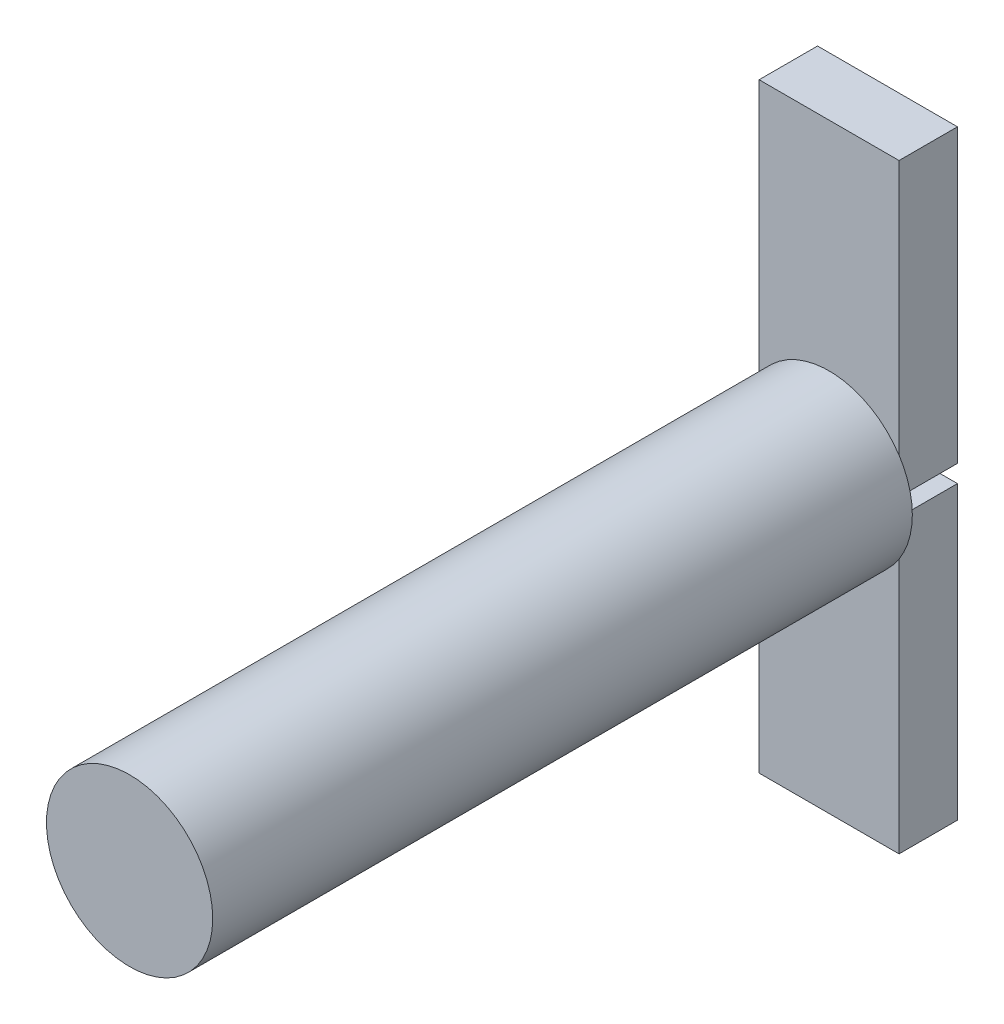
ISO-10303-21;
HEADER;
FILE_DESCRIPTION(('STEP AP214'),'2;1');
FILE_NAME('part.step','',(''),(''),'','','');
FILE_SCHEMA(('AUTOMOTIVE_DESIGN { 1 0 10303 214 1 1 1 1 }'));
ENDSEC;
DATA;
#1=APPLICATION_CONTEXT('core data for automotive mechanical design processes');
#2=APPLICATION_PROTOCOL_DEFINITION('international standard','automotive_design',2000,#1);
#3=PRODUCT_CONTEXT('',#1,'mechanical');
#4=PRODUCT('Part','Part','',(#3));
#5=PRODUCT_RELATED_PRODUCT_CATEGORY('part','',(#4));
#6=PRODUCT_DEFINITION_FORMATION('','',#4);
#7=PRODUCT_DEFINITION_CONTEXT('part definition',#1,'design');
#8=PRODUCT_DEFINITION('design','',#6,#7);
#9=PRODUCT_DEFINITION_SHAPE('','',#8);
#10=(LENGTH_UNIT() NAMED_UNIT(*) SI_UNIT(.MILLI.,.METRE.));
#11=(NAMED_UNIT(*) PLANE_ANGLE_UNIT() SI_UNIT($,.RADIAN.));
#12=(NAMED_UNIT(*) SI_UNIT($,.STERADIAN.) SOLID_ANGLE_UNIT());
#13=UNCERTAINTY_MEASURE_WITH_UNIT(LENGTH_MEASURE(1.E-05),#10,'distance_accuracy_value','');
#14=(GEOMETRIC_REPRESENTATION_CONTEXT(3) GLOBAL_UNCERTAINTY_ASSIGNED_CONTEXT((#13)) GLOBAL_UNIT_ASSIGNED_CONTEXT((#10,
#11,#12)) REPRESENTATION_CONTEXT('',''));
#15=CARTESIAN_POINT('',(0.,0.,0.));
#16=DIRECTION('',(0.,0.,1.));
#17=DIRECTION('',(1.,0.,0.));
#18=AXIS2_PLACEMENT_3D('',#15,#16,#17);
#19=CARTESIAN_POINT('',(0.,0.,60.));
#20=DIRECTION('',(0.,0.,-1.));
#21=DIRECTION('',(-1.,0.,0.));
#22=AXIS2_PLACEMENT_3D('',#19,#20,#21);
#23=CYLINDRICAL_SURFACE('',#22,7.13);
#24=CARTESIAN_POINT('',(0.,0.,60.));
#25=DIRECTION('',(0.,0.,1.));
#26=DIRECTION('',(1.,0.,0.));
#27=AXIS2_PLACEMENT_3D('',#24,#25,#26);
#28=CIRCLE('',#27,7.13);
#29=CARTESIAN_POINT('',(7.13,0.,60.));
#30=VERTEX_POINT('',#29);
#31=EDGE_CURVE('E234',#30,#30,#28,.T.);
#32=ORIENTED_EDGE('',*,*,#31,.F.);
#33=EDGE_LOOP('',(#32));
#34=FACE_BOUND('',#33,.T.);
#35=CARTESIAN_POINT('',(0.,0.,0.0100000000000031));
#36=DIRECTION('',(0.,0.,-1.));
#37=DIRECTION('',(-1.,0.,0.));
#38=AXIS2_PLACEMENT_3D('',#35,#36,#37);
#39=CIRCLE('',#38,7.13);
#40=CARTESIAN_POINT('',(-6.,3.85186967588469,0.0100000000000031));
#41=VERTEX_POINT('',#40);
#42=CARTESIAN_POINT('',(6.,3.85186967588469,0.0100000000000031));
#43=VERTEX_POINT('',#42);
#44=EDGE_CURVE('E11',#41,#43,#39,.T.);
#45=ORIENTED_EDGE('',*,*,#44,.F.);
#46=DIRECTION('',(0.,0.,-1.));
#47=VECTOR('',#46,1.);
#48=CARTESIAN_POINT('',(-6.,3.85186967588469,60.));
#49=LINE('',#48,#47);
#50=CARTESIAN_POINT('',(-6.,3.85186967588469,0.));
#51=VERTEX_POINT('',#50);
#52=EDGE_CURVE('E182',#41,#51,#49,.T.);
#53=ORIENTED_EDGE('',*,*,#52,.T.);
#54=CARTESIAN_POINT('',(0.,0.,0.));
#55=DIRECTION('',(0.,0.,1.));
#56=DIRECTION('',(1.,0.,0.));
#57=AXIS2_PLACEMENT_3D('',#54,#55,#56);
#58=CIRCLE('',#57,7.13);
#59=CARTESIAN_POINT('',(-6.,-3.85186967588469,0.));
#60=VERTEX_POINT('',#59);
#61=EDGE_CURVE('E62',#51,#60,#58,.T.);
#62=ORIENTED_EDGE('',*,*,#61,.T.);
#63=DIRECTION('',(0.,0.,-1.));
#64=VECTOR('',#63,1.);
#65=CARTESIAN_POINT('',(-6.,-3.85186967588469,60.));
#66=LINE('',#65,#64);
#67=CARTESIAN_POINT('',(-6.,-3.85186967588469,0.0100000000000031));
#68=VERTEX_POINT('',#67);
#69=EDGE_CURVE('E217',#60,#68,#66,.F.);
#70=ORIENTED_EDGE('',*,*,#69,.T.);
#71=CARTESIAN_POINT('',(0.,0.,0.0100000000000031));
#72=DIRECTION('',(0.,0.,1.));
#73=DIRECTION('',(1.,0.,0.));
#74=AXIS2_PLACEMENT_3D('',#71,#72,#73);
#75=CIRCLE('',#74,7.13);
#76=CARTESIAN_POINT('',(6.,-3.85186967588469,0.0100000000000031));
#77=VERTEX_POINT('',#76);
#78=EDGE_CURVE('E254',#68,#77,#75,.T.);
#79=ORIENTED_EDGE('',*,*,#78,.T.);
#80=DIRECTION('',(0.,0.,-1.));
#81=VECTOR('',#80,1.);
#82=CARTESIAN_POINT('',(6.,-3.85186967588469,60.));
#83=LINE('',#82,#81);
#84=CARTESIAN_POINT('',(6.,-3.85186967588469,0.));
#85=VERTEX_POINT('',#84);
#86=EDGE_CURVE('E230',#77,#85,#83,.T.);
#87=ORIENTED_EDGE('',*,*,#86,.T.);
#88=CARTESIAN_POINT('',(6.,3.85186967588469,0.));
#89=VERTEX_POINT('',#88);
#90=EDGE_CURVE('E239',#85,#89,#58,.T.);
#91=ORIENTED_EDGE('',*,*,#90,.T.);
#92=DIRECTION('',(0.,0.,-1.));
#93=VECTOR('',#92,1.);
#94=CARTESIAN_POINT('',(6.,3.85186967588469,60.));
#95=LINE('',#94,#93);
#96=EDGE_CURVE('E54',#89,#43,#95,.F.);
#97=ORIENTED_EDGE('',*,*,#96,.T.);
#98=EDGE_LOOP('',(#45,#53,#62,#70,#79,#87,#91,#97));
#99=FACE_BOUND('',#98,.T.);
#100=ADVANCED_FACE('F39',(#34,#99),#23,.T.);
#101=CARTESIAN_POINT('',(0.,0.,60.));
#102=DIRECTION('',(0.,0.,1.));
#103=DIRECTION('',(1.,0.,0.));
#104=AXIS2_PLACEMENT_3D('',#101,#102,#103);
#105=PLANE('',#104);
#106=ORIENTED_EDGE('',*,*,#31,.T.);
#107=EDGE_LOOP('',(#106));
#108=FACE_BOUND('',#107,.T.);
#109=ADVANCED_FACE('F287',(#108),#105,.T.);
#110=CARTESIAN_POINT('',(0.,0.,0.));
#111=DIRECTION('',(0.,0.,1.));
#112=DIRECTION('',(1.,0.,0.));
#113=AXIS2_PLACEMENT_3D('',#110,#111,#112);
#114=PLANE('',#113);
#115=ORIENTED_EDGE('',*,*,#61,.F.);
#116=DIRECTION('',(0.,-1.,0.));
#117=VECTOR('',#116,1.);
#118=CARTESIAN_POINT('',(-6.,0.,0.));
#119=LINE('',#118,#117);
#120=CARTESIAN_POINT('',(-6.,0.750000000000001,0.));
#121=VERTEX_POINT('',#120);
#122=EDGE_CURVE('E47',#51,#121,#119,.T.);
#123=ORIENTED_EDGE('',*,*,#122,.T.);
#124=DIRECTION('',(1.,0.,0.));
#125=VECTOR('',#124,1.);
#126=CARTESIAN_POINT('',(0.,0.75,0.));
#127=LINE('',#126,#125);
#128=CARTESIAN_POINT('',(6.,0.749999999999999,0.));
#129=VERTEX_POINT('',#128);
#130=EDGE_CURVE('E261',#121,#129,#127,.T.);
#131=ORIENTED_EDGE('',*,*,#130,.T.);
#132=DIRECTION('',(0.,1.,0.));
#133=VECTOR('',#132,1.);
#134=CARTESIAN_POINT('',(6.,0.,0.));
#135=LINE('',#134,#133);
#136=EDGE_CURVE('E258',#129,#89,#135,.T.);
#137=ORIENTED_EDGE('',*,*,#136,.T.);
#138=ORIENTED_EDGE('',*,*,#90,.F.);
#139=DIRECTION('',(0.,1.,0.));
#140=VECTOR('',#139,1.);
#141=CARTESIAN_POINT('',(6.,0.,0.));
#142=LINE('',#141,#140);
#143=CARTESIAN_POINT('',(6.,-0.749999999999999,0.));
#144=VERTEX_POINT('',#143);
#145=EDGE_CURVE('E250',#85,#144,#142,.T.);
#146=ORIENTED_EDGE('',*,*,#145,.T.);
#147=DIRECTION('',(-1.,0.,0.));
#148=VECTOR('',#147,1.);
#149=CARTESIAN_POINT('',(0.,-0.75,0.));
#150=LINE('',#149,#148);
#151=CARTESIAN_POINT('',(-6.,-0.750000000000001,0.));
#152=VERTEX_POINT('',#151);
#153=EDGE_CURVE('E246',#144,#152,#150,.T.);
#154=ORIENTED_EDGE('',*,*,#153,.T.);
#155=DIRECTION('',(0.,-1.,0.));
#156=VECTOR('',#155,1.);
#157=CARTESIAN_POINT('',(-6.,0.,0.));
#158=LINE('',#157,#156);
#159=EDGE_CURVE('E238',#152,#60,#158,.T.);
#160=ORIENTED_EDGE('',*,*,#159,.T.);
#161=EDGE_LOOP('',(#115,#123,#131,#137,#138,#146,#154,#160));
#162=FACE_BOUND('',#161,.T.);
#163=ADVANCED_FACE('F267',(#162),#114,.F.);
#164=CARTESIAN_POINT('',(6.,-0.749999999999999,-5.));
#165=DIRECTION('',(0.,1.,0.));
#166=DIRECTION('',(-1.,0.,0.));
#167=AXIS2_PLACEMENT_3D('',#164,#165,#166);
#168=PLANE('',#167);
#169=ORIENTED_EDGE('',*,*,#153,.F.);
#170=DIRECTION('',(0.,0.,1.));
#171=VECTOR('',#170,1.);
#172=CARTESIAN_POINT('',(6.,-0.749999999999999,-5.));
#173=LINE('',#172,#171);
#174=CARTESIAN_POINT('',(6.,-0.749999999999999,-5.));
#175=VERTEX_POINT('',#174);
#176=EDGE_CURVE('E213',#175,#144,#173,.T.);
#177=ORIENTED_EDGE('',*,*,#176,.F.);
#178=DIRECTION('',(-1.,0.,0.));
#179=VECTOR('',#178,1.);
#180=CARTESIAN_POINT('',(6.,-0.749999999999999,-5.));
#181=LINE('',#180,#179);
#182=CARTESIAN_POINT('',(-6.,-0.750000000000001,-5.));
#183=VERTEX_POINT('',#182);
#184=EDGE_CURVE('E196',#175,#183,#181,.T.);
#185=ORIENTED_EDGE('',*,*,#184,.T.);
#186=DIRECTION('',(0.,0.,1.));
#187=VECTOR('',#186,1.);
#188=CARTESIAN_POINT('',(-6.,-0.750000000000001,-5.));
#189=LINE('',#188,#187);
#190=EDGE_CURVE('E212',#183,#152,#189,.T.);
#191=ORIENTED_EDGE('',*,*,#190,.T.);
#192=EDGE_LOOP('',(#169,#177,#185,#191));
#193=FACE_BOUND('',#192,.T.);
#194=ADVANCED_FACE('F298',(#193),#168,.T.);
#195=CARTESIAN_POINT('',(6.,-0.749999999999999,-5.));
#196=DIRECTION('',(1.,0.,0.));
#197=DIRECTION('',(0.,0.,-1.));
#198=AXIS2_PLACEMENT_3D('',#195,#196,#197);
#199=PLANE('',#198);
#200=ORIENTED_EDGE('',*,*,#86,.F.);
#201=DIRECTION('',(0.,1.,0.));
#202=VECTOR('',#201,1.);
#203=CARTESIAN_POINT('',(6.,-0.749999999999999,0.01));
#204=LINE('',#203,#202);
#205=CARTESIAN_POINT('',(6.,-25.75,0.01));
#206=VERTEX_POINT('',#205);
#207=EDGE_CURVE('E192',#206,#77,#204,.T.);
#208=ORIENTED_EDGE('',*,*,#207,.F.);
#209=DIRECTION('',(0.,0.,1.));
#210=VECTOR('',#209,1.);
#211=CARTESIAN_POINT('',(6.,-25.75,-5.));
#212=LINE('',#211,#210);
#213=CARTESIAN_POINT('',(6.,-25.75,-5.));
#214=VERTEX_POINT('',#213);
#215=EDGE_CURVE('E218',#214,#206,#212,.T.);
#216=ORIENTED_EDGE('',*,*,#215,.F.);
#217=DIRECTION('',(0.,1.,0.));
#218=VECTOR('',#217,1.);
#219=CARTESIAN_POINT('',(6.,-0.749999999999999,-5.));
#220=LINE('',#219,#218);
#221=EDGE_CURVE('E208',#214,#175,#220,.T.);
#222=ORIENTED_EDGE('',*,*,#221,.T.);
#223=ORIENTED_EDGE('',*,*,#176,.T.);
#224=ORIENTED_EDGE('',*,*,#145,.F.);
#225=EDGE_LOOP('',(#200,#208,#216,#222,#223,#224));
#226=FACE_BOUND('',#225,.T.);
#227=ADVANCED_FACE('F302',(#226),#199,.T.);
#228=CARTESIAN_POINT('',(-6.,-0.750000000000001,-5.));
#229=DIRECTION('',(-1.,0.,0.));
#230=DIRECTION('',(0.,-1.,0.));
#231=AXIS2_PLACEMENT_3D('',#228,#229,#230);
#232=PLANE('',#231);
#233=ORIENTED_EDGE('',*,*,#69,.F.);
#234=ORIENTED_EDGE('',*,*,#159,.F.);
#235=ORIENTED_EDGE('',*,*,#190,.F.);
#236=DIRECTION('',(0.,-1.,0.));
#237=VECTOR('',#236,1.);
#238=CARTESIAN_POINT('',(-6.,-0.750000000000001,-5.));
#239=LINE('',#238,#237);
#240=CARTESIAN_POINT('',(-6.,-25.75,-5.));
#241=VERTEX_POINT('',#240);
#242=EDGE_CURVE('E200',#183,#241,#239,.T.);
#243=ORIENTED_EDGE('',*,*,#242,.T.);
#244=DIRECTION('',(0.,0.,1.));
#245=VECTOR('',#244,1.);
#246=CARTESIAN_POINT('',(-6.,-25.75,-5.));
#247=LINE('',#246,#245);
#248=CARTESIAN_POINT('',(-6.,-25.75,0.01));
#249=VERTEX_POINT('',#248);
#250=EDGE_CURVE('E221',#241,#249,#247,.T.);
#251=ORIENTED_EDGE('',*,*,#250,.T.);
#252=DIRECTION('',(0.,-1.,0.));
#253=VECTOR('',#252,1.);
#254=CARTESIAN_POINT('',(-6.,-0.750000000000001,0.01));
#255=LINE('',#254,#253);
#256=EDGE_CURVE('E185',#68,#249,#255,.T.);
#257=ORIENTED_EDGE('',*,*,#256,.F.);
#258=EDGE_LOOP('',(#233,#234,#235,#243,#251,#257));
#259=FACE_BOUND('',#258,.T.);
#260=ADVANCED_FACE('F304',(#259),#232,.T.);
#261=CARTESIAN_POINT('',(6.,-25.75,-5.));
#262=DIRECTION('',(0.,-1.,0.));
#263=DIRECTION('',(0.,0.,-1.));
#264=AXIS2_PLACEMENT_3D('',#261,#262,#263);
#265=PLANE('',#264);
#266=ORIENTED_EDGE('',*,*,#215,.T.);
#267=DIRECTION('',(1.,0.,0.));
#268=VECTOR('',#267,1.);
#269=CARTESIAN_POINT('',(6.,-25.75,0.01));
#270=LINE('',#269,#268);
#271=EDGE_CURVE('E188',#249,#206,#270,.T.);
#272=ORIENTED_EDGE('',*,*,#271,.F.);
#273=ORIENTED_EDGE('',*,*,#250,.F.);
#274=DIRECTION('',(1.,0.,0.));
#275=VECTOR('',#274,1.);
#276=CARTESIAN_POINT('',(6.,-25.75,-5.));
#277=LINE('',#276,#275);
#278=EDGE_CURVE('E204',#241,#214,#277,.T.);
#279=ORIENTED_EDGE('',*,*,#278,.T.);
#280=EDGE_LOOP('',(#266,#272,#273,#279));
#281=FACE_BOUND('',#280,.T.);
#282=ADVANCED_FACE('F307',(#281),#265,.T.);
#283=CARTESIAN_POINT('',(0.,0.,-5.));
#284=DIRECTION('',(0.,0.,1.));
#285=DIRECTION('',(1.,0.,0.));
#286=AXIS2_PLACEMENT_3D('',#283,#284,#285);
#287=PLANE('',#286);
#288=ORIENTED_EDGE('',*,*,#184,.F.);
#289=ORIENTED_EDGE('',*,*,#221,.F.);
#290=ORIENTED_EDGE('',*,*,#278,.F.);
#291=ORIENTED_EDGE('',*,*,#242,.F.);
#292=EDGE_LOOP('',(#288,#289,#290,#291));
#293=FACE_BOUND('',#292,.T.);
#294=ADVANCED_FACE('F311',(#293),#287,.F.);
#295=CARTESIAN_POINT('',(0.,0.,0.01));
#296=DIRECTION('',(0.,0.,1.));
#297=DIRECTION('',(1.,0.,0.));
#298=AXIS2_PLACEMENT_3D('',#295,#296,#297);
#299=PLANE('',#298);
#300=ORIENTED_EDGE('',*,*,#78,.F.);
#301=ORIENTED_EDGE('',*,*,#256,.T.);
#302=ORIENTED_EDGE('',*,*,#271,.T.);
#303=ORIENTED_EDGE('',*,*,#207,.T.);
#304=EDGE_LOOP('',(#300,#301,#302,#303));
#305=FACE_BOUND('',#304,.T.);
#306=ADVANCED_FACE('F318',(#305),#299,.T.);
#307=CARTESIAN_POINT('',(6.,0.749999999999999,-5.));
#308=DIRECTION('',(0.,-1.,0.));
#309=DIRECTION('',(1.,0.,0.));
#310=AXIS2_PLACEMENT_3D('',#307,#308,#309);
#311=PLANE('',#310);
#312=ORIENTED_EDGE('',*,*,#130,.F.);
#313=DIRECTION('',(0.,0.,1.));
#314=VECTOR('',#313,1.);
#315=CARTESIAN_POINT('',(-6.,0.750000000000001,-5.));
#316=LINE('',#315,#314);
#317=CARTESIAN_POINT('',(-6.,0.750000000000001,-5.));
#318=VERTEX_POINT('',#317);
#319=EDGE_CURVE('E171',#318,#121,#316,.T.);
#320=ORIENTED_EDGE('',*,*,#319,.F.);
#321=DIRECTION('',(1.,0.,0.));
#322=VECTOR('',#321,1.);
#323=CARTESIAN_POINT('',(6.,0.749999999999999,-5.));
#324=LINE('',#323,#322);
#325=CARTESIAN_POINT('',(6.,0.749999999999999,-5.));
#326=VERTEX_POINT('',#325);
#327=EDGE_CURVE('E156',#318,#326,#324,.T.);
#328=ORIENTED_EDGE('',*,*,#327,.T.);
#329=DIRECTION('',(0.,0.,1.));
#330=VECTOR('',#329,1.);
#331=CARTESIAN_POINT('',(6.,0.749999999999999,-5.));
#332=LINE('',#331,#330);
#333=EDGE_CURVE('E149',#326,#129,#332,.T.);
#334=ORIENTED_EDGE('',*,*,#333,.T.);
#335=EDGE_LOOP('',(#312,#320,#328,#334));
#336=FACE_BOUND('',#335,.T.);
#337=ADVANCED_FACE('F272',(#336),#311,.T.);
#338=CARTESIAN_POINT('',(-6.,0.750000000000001,-5.));
#339=DIRECTION('',(-1.,0.,0.));
#340=DIRECTION('',(0.,-1.,0.));
#341=AXIS2_PLACEMENT_3D('',#338,#339,#340);
#342=PLANE('',#341);
#343=ORIENTED_EDGE('',*,*,#52,.F.);
#344=DIRECTION('',(0.,-1.,0.));
#345=VECTOR('',#344,1.);
#346=CARTESIAN_POINT('',(-6.,0.750000000000001,0.01));
#347=LINE('',#346,#345);
#348=CARTESIAN_POINT('',(-6.,25.75,0.01));
#349=VERTEX_POINT('',#348);
#350=EDGE_CURVE('E153',#349,#41,#347,.T.);
#351=ORIENTED_EDGE('',*,*,#350,.F.);
#352=DIRECTION('',(0.,0.,1.));
#353=VECTOR('',#352,1.);
#354=CARTESIAN_POINT('',(-6.,25.75,-5.));
#355=LINE('',#354,#353);
#356=CARTESIAN_POINT('',(-6.,25.75,-5.));
#357=VERTEX_POINT('',#356);
#358=EDGE_CURVE('E148',#357,#349,#355,.T.);
#359=ORIENTED_EDGE('',*,*,#358,.F.);
#360=DIRECTION('',(0.,-1.,0.));
#361=VECTOR('',#360,1.);
#362=CARTESIAN_POINT('',(-6.,0.750000000000001,-5.));
#363=LINE('',#362,#361);
#364=EDGE_CURVE('E167',#357,#318,#363,.T.);
#365=ORIENTED_EDGE('',*,*,#364,.T.);
#366=ORIENTED_EDGE('',*,*,#319,.T.);
#367=ORIENTED_EDGE('',*,*,#122,.F.);
#368=EDGE_LOOP('',(#343,#351,#359,#365,#366,#367));
#369=FACE_BOUND('',#368,.T.);
#370=ADVANCED_FACE('F269',(#369),#342,.T.);
#371=CARTESIAN_POINT('',(6.,0.749999999999999,-5.));
#372=DIRECTION('',(1.,0.,0.));
#373=DIRECTION('',(0.,0.,-1.));
#374=AXIS2_PLACEMENT_3D('',#371,#372,#373);
#375=PLANE('',#374);
#376=ORIENTED_EDGE('',*,*,#96,.F.);
#377=ORIENTED_EDGE('',*,*,#136,.F.);
#378=ORIENTED_EDGE('',*,*,#333,.F.);
#379=DIRECTION('',(0.,1.,0.));
#380=VECTOR('',#379,1.);
#381=CARTESIAN_POINT('',(6.,0.749999999999999,-5.));
#382=LINE('',#381,#380);
#383=CARTESIAN_POINT('',(6.,25.75,-5.));
#384=VERTEX_POINT('',#383);
#385=EDGE_CURVE('E143',#326,#384,#382,.T.);
#386=ORIENTED_EDGE('',*,*,#385,.T.);
#387=DIRECTION('',(0.,0.,1.));
#388=VECTOR('',#387,1.);
#389=CARTESIAN_POINT('',(6.,25.75,-5.));
#390=LINE('',#389,#388);
#391=CARTESIAN_POINT('',(6.,25.75,0.01));
#392=VERTEX_POINT('',#391);
#393=EDGE_CURVE('E140',#384,#392,#390,.T.);
#394=ORIENTED_EDGE('',*,*,#393,.T.);
#395=DIRECTION('',(0.,1.,0.));
#396=VECTOR('',#395,1.);
#397=CARTESIAN_POINT('',(6.,0.749999999999999,0.01));
#398=LINE('',#397,#396);
#399=EDGE_CURVE('E129',#43,#392,#398,.T.);
#400=ORIENTED_EDGE('',*,*,#399,.F.);
#401=EDGE_LOOP('',(#376,#377,#378,#386,#394,#400));
#402=FACE_BOUND('',#401,.T.);
#403=ADVANCED_FACE('F141',(#402),#375,.T.);
#404=CARTESIAN_POINT('',(6.,25.75,-5.));
#405=DIRECTION('',(0.,1.,0.));
#406=DIRECTION('',(0.,0.,1.));
#407=AXIS2_PLACEMENT_3D('',#404,#405,#406);
#408=PLANE('',#407);
#409=ORIENTED_EDGE('',*,*,#358,.T.);
#410=DIRECTION('',(-1.,0.,0.));
#411=VECTOR('',#410,1.);
#412=CARTESIAN_POINT('',(6.,25.75,0.01));
#413=LINE('',#412,#411);
#414=EDGE_CURVE('E134',#392,#349,#413,.T.);
#415=ORIENTED_EDGE('',*,*,#414,.F.);
#416=ORIENTED_EDGE('',*,*,#393,.F.);
#417=DIRECTION('',(-1.,0.,0.));
#418=VECTOR('',#417,1.);
#419=CARTESIAN_POINT('',(6.,25.75,-5.));
#420=LINE('',#419,#418);
#421=EDGE_CURVE('E164',#384,#357,#420,.T.);
#422=ORIENTED_EDGE('',*,*,#421,.T.);
#423=EDGE_LOOP('',(#409,#415,#416,#422));
#424=FACE_BOUND('',#423,.T.);
#425=ADVANCED_FACE('F151',(#424),#408,.T.);
#426=CARTESIAN_POINT('',(0.,0.,-5.));
#427=DIRECTION('',(0.,0.,-1.));
#428=DIRECTION('',(-1.,0.,0.));
#429=AXIS2_PLACEMENT_3D('',#426,#427,#428);
#430=PLANE('',#429);
#431=ORIENTED_EDGE('',*,*,#327,.F.);
#432=ORIENTED_EDGE('',*,*,#364,.F.);
#433=ORIENTED_EDGE('',*,*,#421,.F.);
#434=ORIENTED_EDGE('',*,*,#385,.F.);
#435=EDGE_LOOP('',(#431,#432,#433,#434));
#436=FACE_BOUND('',#435,.T.);
#437=ADVANCED_FACE('F276',(#436),#430,.T.);
#438=CARTESIAN_POINT('',(0.,0.,0.01));
#439=DIRECTION('',(0.,0.,-1.));
#440=DIRECTION('',(-1.,0.,0.));
#441=AXIS2_PLACEMENT_3D('',#438,#439,#440);
#442=PLANE('',#441);
#443=ORIENTED_EDGE('',*,*,#350,.T.);
#444=ORIENTED_EDGE('',*,*,#44,.T.);
#445=ORIENTED_EDGE('',*,*,#399,.T.);
#446=ORIENTED_EDGE('',*,*,#414,.T.);
#447=EDGE_LOOP('',(#443,#444,#445,#446));
#448=FACE_BOUND('',#447,.T.);
#449=ADVANCED_FACE('F132',(#448),#442,.F.);
#450=CLOSED_SHELL('',(#100,#109,#163,#194,#227,#260,#282,#294,#306,#337,#370,#403,#425,#437,#449));
#451=MANIFOLD_SOLID_BREP('B2',#450);
#452=ADVANCED_BREP_SHAPE_REPRESENTATION('',(#18,#451),#14);
#453=SHAPE_DEFINITION_REPRESENTATION(#9,#452);
ENDSEC;
END-ISO-10303-21;
